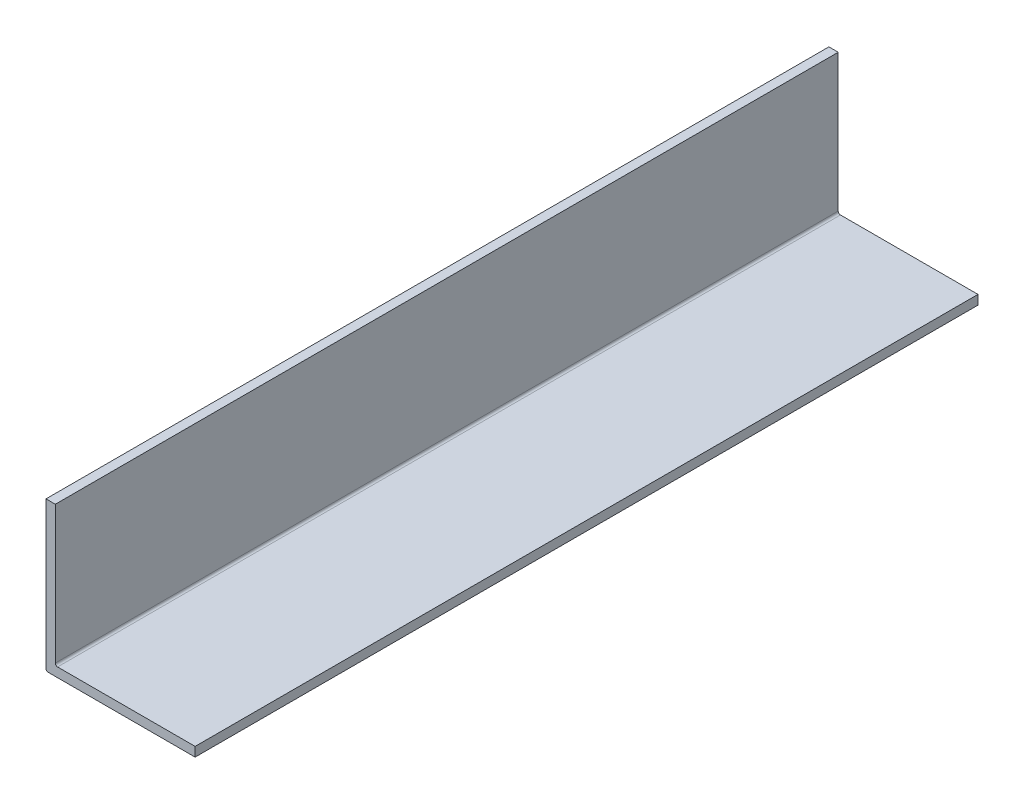
ISO-10303-21;
HEADER;
FILE_DESCRIPTION(('STEP AP214'),'2;1');
FILE_NAME('part.step','',(''),(''),'','','');
FILE_SCHEMA(('AUTOMOTIVE_DESIGN { 1 0 10303 214 1 1 1 1 }'));
ENDSEC;
DATA;
#1=APPLICATION_CONTEXT('core data for automotive mechanical design processes');
#2=APPLICATION_PROTOCOL_DEFINITION('international standard','automotive_design',2000,#1);
#3=PRODUCT_CONTEXT('',#1,'mechanical');
#4=PRODUCT('Part','Part','',(#3));
#5=PRODUCT_RELATED_PRODUCT_CATEGORY('part','',(#4));
#6=PRODUCT_DEFINITION_FORMATION('','',#4);
#7=PRODUCT_DEFINITION_CONTEXT('part definition',#1,'design');
#8=PRODUCT_DEFINITION('design','',#6,#7);
#9=PRODUCT_DEFINITION_SHAPE('','',#8);
#10=(LENGTH_UNIT() NAMED_UNIT(*) SI_UNIT(.MILLI.,.METRE.));
#11=(NAMED_UNIT(*) PLANE_ANGLE_UNIT() SI_UNIT($,.RADIAN.));
#12=(NAMED_UNIT(*) SI_UNIT($,.STERADIAN.) SOLID_ANGLE_UNIT());
#13=UNCERTAINTY_MEASURE_WITH_UNIT(LENGTH_MEASURE(1.E-05),#10,'distance_accuracy_value','');
#14=(GEOMETRIC_REPRESENTATION_CONTEXT(3) GLOBAL_UNCERTAINTY_ASSIGNED_CONTEXT((#13)) GLOBAL_UNIT_ASSIGNED_CONTEXT((#10,
#11,#12)) REPRESENTATION_CONTEXT('',''));
#15=CARTESIAN_POINT('',(0.,0.,0.));
#16=DIRECTION('',(0.,0.,1.));
#17=DIRECTION('',(1.,0.,0.));
#18=AXIS2_PLACEMENT_3D('',#15,#16,#17);
#19=CARTESIAN_POINT('',(0.,50.8,266.7));
#20=DIRECTION('',(0.,-1.,0.));
#21=DIRECTION('',(0.,0.,-1.));
#22=AXIS2_PLACEMENT_3D('',#19,#20,#21);
#23=PLANE('',#22);
#24=DIRECTION('',(-1.,0.,0.));
#25=VECTOR('',#24,1.);
#26=CARTESIAN_POINT('',(0.,50.8,0.));
#27=LINE('',#26,#25);
#28=CARTESIAN_POINT('',(3.17499999999999,50.8,0.));
#29=VERTEX_POINT('',#28);
#30=CARTESIAN_POINT('',(0.,50.8,0.));
#31=VERTEX_POINT('',#30);
#32=EDGE_CURVE('E128',#29,#31,#27,.T.);
#33=ORIENTED_EDGE('',*,*,#32,.T.);
#34=DIRECTION('',(0.,0.,-1.));
#35=VECTOR('',#34,1.);
#36=CARTESIAN_POINT('',(0.,50.8,266.7));
#37=LINE('',#36,#35);
#38=CARTESIAN_POINT('',(0.,50.8,266.7));
#39=VERTEX_POINT('',#38);
#40=EDGE_CURVE('E11',#39,#31,#37,.T.);
#41=ORIENTED_EDGE('',*,*,#40,.F.);
#42=DIRECTION('',(-1.,0.,0.));
#43=VECTOR('',#42,1.);
#44=CARTESIAN_POINT('',(0.,50.8,266.7));
#45=LINE('',#44,#43);
#46=CARTESIAN_POINT('',(3.17499999999999,50.8,266.7));
#47=VERTEX_POINT('',#46);
#48=EDGE_CURVE('E142',#47,#39,#45,.T.);
#49=ORIENTED_EDGE('',*,*,#48,.F.);
#50=DIRECTION('',(0.,0.,-1.));
#51=VECTOR('',#50,1.);
#52=CARTESIAN_POINT('',(3.17499999999999,50.8,266.7));
#53=LINE('',#52,#51);
#54=EDGE_CURVE('E124',#47,#29,#53,.T.);
#55=ORIENTED_EDGE('',*,*,#54,.T.);
#56=EDGE_LOOP('',(#33,#41,#49,#55));
#57=FACE_BOUND('',#56,.T.);
#58=ADVANCED_FACE('F32',(#57),#23,.F.);
#59=CARTESIAN_POINT('',(0.,0.762000000000005,266.7));
#60=DIRECTION('',(1.,0.,0.));
#61=DIRECTION('',(0.,0.,-1.));
#62=AXIS2_PLACEMENT_3D('',#59,#60,#61);
#63=PLANE('',#62);
#64=DIRECTION('',(0.,-1.,0.));
#65=VECTOR('',#64,1.);
#66=CARTESIAN_POINT('',(0.,0.762000000000005,0.));
#67=LINE('',#66,#65);
#68=CARTESIAN_POINT('',(0.,0.762000000000005,0.));
#69=VERTEX_POINT('',#68);
#70=EDGE_CURVE('E131',#31,#69,#67,.T.);
#71=ORIENTED_EDGE('',*,*,#70,.T.);
#72=DIRECTION('',(0.,0.,-1.));
#73=VECTOR('',#72,1.);
#74=CARTESIAN_POINT('',(0.,0.762000000000005,266.7));
#75=LINE('',#74,#73);
#76=CARTESIAN_POINT('',(0.,0.762000000000005,266.7));
#77=VERTEX_POINT('',#76);
#78=EDGE_CURVE('E40',#77,#69,#75,.T.);
#79=ORIENTED_EDGE('',*,*,#78,.F.);
#80=DIRECTION('',(0.,-1.,0.));
#81=VECTOR('',#80,1.);
#82=CARTESIAN_POINT('',(0.,0.762000000000005,266.7));
#83=LINE('',#82,#81);
#84=EDGE_CURVE('E91',#39,#77,#83,.T.);
#85=ORIENTED_EDGE('',*,*,#84,.F.);
#86=ORIENTED_EDGE('',*,*,#40,.T.);
#87=EDGE_LOOP('',(#71,#79,#85,#86));
#88=FACE_BOUND('',#87,.T.);
#89=ADVANCED_FACE('F177',(#88),#63,.F.);
#90=CARTESIAN_POINT('',(0.762,0.762,266.7));
#91=DIRECTION('',(0.,0.,-1.));
#92=DIRECTION('',(-1.,0.,0.));
#93=AXIS2_PLACEMENT_3D('',#90,#91,#92);
#94=CYLINDRICAL_SURFACE('',#93,0.762);
#95=CARTESIAN_POINT('',(0.762,0.762,0.));
#96=DIRECTION('',(0.,0.,1.));
#97=DIRECTION('',(1.,0.,0.));
#98=AXIS2_PLACEMENT_3D('',#95,#96,#97);
#99=CIRCLE('',#98,0.762);
#100=CARTESIAN_POINT('',(0.762000000000005,0.,0.));
#101=VERTEX_POINT('',#100);
#102=EDGE_CURVE('E133',#69,#101,#99,.T.);
#103=ORIENTED_EDGE('',*,*,#102,.T.);
#104=DIRECTION('',(0.,0.,-1.));
#105=VECTOR('',#104,1.);
#106=CARTESIAN_POINT('',(0.762000000000005,0.,266.7));
#107=LINE('',#106,#105);
#108=CARTESIAN_POINT('',(0.762000000000005,0.,266.7));
#109=VERTEX_POINT('',#108);
#110=EDGE_CURVE('E149',#109,#101,#107,.T.);
#111=ORIENTED_EDGE('',*,*,#110,.F.);
#112=CARTESIAN_POINT('',(0.762,0.762,266.7));
#113=DIRECTION('',(0.,0.,1.));
#114=DIRECTION('',(1.,0.,0.));
#115=AXIS2_PLACEMENT_3D('',#112,#113,#114);
#116=CIRCLE('',#115,0.762);
#117=EDGE_CURVE('E157',#77,#109,#116,.T.);
#118=ORIENTED_EDGE('',*,*,#117,.F.);
#119=ORIENTED_EDGE('',*,*,#78,.T.);
#120=EDGE_LOOP('',(#103,#111,#118,#119));
#121=FACE_BOUND('',#120,.T.);
#122=ADVANCED_FACE('F155',(#121),#94,.T.);
#123=CARTESIAN_POINT('',(0.762000000000005,0.,266.7));
#124=DIRECTION('',(0.,1.,0.));
#125=DIRECTION('',(0.,0.,1.));
#126=AXIS2_PLACEMENT_3D('',#123,#124,#125);
#127=PLANE('',#126);
#128=DIRECTION('',(1.,0.,0.));
#129=VECTOR('',#128,1.);
#130=CARTESIAN_POINT('',(0.762000000000005,0.,0.));
#131=LINE('',#130,#129);
#132=CARTESIAN_POINT('',(50.8,0.,0.));
#133=VERTEX_POINT('',#132);
#134=EDGE_CURVE('E135',#101,#133,#131,.T.);
#135=ORIENTED_EDGE('',*,*,#134,.T.);
#136=DIRECTION('',(0.,0.,-1.));
#137=VECTOR('',#136,1.);
#138=CARTESIAN_POINT('',(50.8,0.,266.7));
#139=LINE('',#138,#137);
#140=CARTESIAN_POINT('',(50.8,0.,266.7));
#141=VERTEX_POINT('',#140);
#142=EDGE_CURVE('E146',#141,#133,#139,.T.);
#143=ORIENTED_EDGE('',*,*,#142,.F.);
#144=DIRECTION('',(1.,0.,0.));
#145=VECTOR('',#144,1.);
#146=CARTESIAN_POINT('',(0.762000000000005,0.,266.7));
#147=LINE('',#146,#145);
#148=EDGE_CURVE('E169',#109,#141,#147,.T.);
#149=ORIENTED_EDGE('',*,*,#148,.F.);
#150=ORIENTED_EDGE('',*,*,#110,.T.);
#151=EDGE_LOOP('',(#135,#143,#149,#150));
#152=FACE_BOUND('',#151,.T.);
#153=ADVANCED_FACE('F165',(#152),#127,.F.);
#154=CARTESIAN_POINT('',(50.8,0.,266.7));
#155=DIRECTION('',(-1.,0.,0.));
#156=DIRECTION('',(0.,0.,1.));
#157=AXIS2_PLACEMENT_3D('',#154,#155,#156);
#158=PLANE('',#157);
#159=DIRECTION('',(0.,1.,0.));
#160=VECTOR('',#159,1.);
#161=CARTESIAN_POINT('',(50.8,0.,0.));
#162=LINE('',#161,#160);
#163=CARTESIAN_POINT('',(50.8,3.175,0.));
#164=VERTEX_POINT('',#163);
#165=EDGE_CURVE('E137',#133,#164,#162,.T.);
#166=ORIENTED_EDGE('',*,*,#165,.T.);
#167=DIRECTION('',(0.,0.,-1.));
#168=VECTOR('',#167,1.);
#169=CARTESIAN_POINT('',(50.8,3.175,266.7));
#170=LINE('',#169,#168);
#171=CARTESIAN_POINT('',(50.8,3.175,266.7));
#172=VERTEX_POINT('',#171);
#173=EDGE_CURVE('E119',#172,#164,#170,.T.);
#174=ORIENTED_EDGE('',*,*,#173,.F.);
#175=DIRECTION('',(0.,1.,0.));
#176=VECTOR('',#175,1.);
#177=CARTESIAN_POINT('',(50.8,0.,266.7));
#178=LINE('',#177,#176);
#179=EDGE_CURVE('E110',#141,#172,#178,.T.);
#180=ORIENTED_EDGE('',*,*,#179,.F.);
#181=ORIENTED_EDGE('',*,*,#142,.T.);
#182=EDGE_LOOP('',(#166,#174,#180,#181));
#183=FACE_BOUND('',#182,.T.);
#184=ADVANCED_FACE('F168',(#183),#158,.F.);
#185=CARTESIAN_POINT('',(3.93699999999999,3.175,266.7));
#186=DIRECTION('',(0.,-1.,0.));
#187=DIRECTION('',(0.,0.,-1.));
#188=AXIS2_PLACEMENT_3D('',#185,#186,#187);
#189=PLANE('',#188);
#190=DIRECTION('',(-1.,0.,0.));
#191=VECTOR('',#190,1.);
#192=CARTESIAN_POINT('',(3.93699999999999,3.175,0.));
#193=LINE('',#192,#191);
#194=CARTESIAN_POINT('',(3.93699999999999,3.175,0.));
#195=VERTEX_POINT('',#194);
#196=EDGE_CURVE('E118',#164,#195,#193,.T.);
#197=ORIENTED_EDGE('',*,*,#196,.T.);
#198=DIRECTION('',(0.,0.,-1.));
#199=VECTOR('',#198,1.);
#200=CARTESIAN_POINT('',(3.93699999999999,3.175,266.7));
#201=LINE('',#200,#199);
#202=CARTESIAN_POINT('',(3.93699999999999,3.175,266.7));
#203=VERTEX_POINT('',#202);
#204=EDGE_CURVE('E115',#203,#195,#201,.T.);
#205=ORIENTED_EDGE('',*,*,#204,.F.);
#206=DIRECTION('',(-1.,0.,0.));
#207=VECTOR('',#206,1.);
#208=CARTESIAN_POINT('',(3.93699999999999,3.175,266.7));
#209=LINE('',#208,#207);
#210=EDGE_CURVE('E104',#172,#203,#209,.T.);
#211=ORIENTED_EDGE('',*,*,#210,.F.);
#212=ORIENTED_EDGE('',*,*,#173,.T.);
#213=EDGE_LOOP('',(#197,#205,#211,#212));
#214=FACE_BOUND('',#213,.T.);
#215=ADVANCED_FACE('F116',(#214),#189,.F.);
#216=CARTESIAN_POINT('',(3.93699999999999,3.937,266.7));
#217=DIRECTION('',(0.,0.,-1.));
#218=DIRECTION('',(-1.,0.,0.));
#219=AXIS2_PLACEMENT_3D('',#216,#217,#218);
#220=CYLINDRICAL_SURFACE('',#219,0.762);
#221=CARTESIAN_POINT('',(3.93699999999999,3.937,0.));
#222=DIRECTION('',(0.,0.,-1.));
#223=DIRECTION('',(1.,0.,0.));
#224=AXIS2_PLACEMENT_3D('',#221,#222,#223);
#225=CIRCLE('',#224,0.762);
#226=CARTESIAN_POINT('',(3.17499999999999,3.937,0.));
#227=VERTEX_POINT('',#226);
#228=EDGE_CURVE('E77',#195,#227,#225,.T.);
#229=ORIENTED_EDGE('',*,*,#228,.T.);
#230=DIRECTION('',(0.,0.,-1.));
#231=VECTOR('',#230,1.);
#232=CARTESIAN_POINT('',(3.17499999999999,3.937,266.7));
#233=LINE('',#232,#231);
#234=CARTESIAN_POINT('',(3.17499999999999,3.937,266.7));
#235=VERTEX_POINT('',#234);
#236=EDGE_CURVE('E120',#235,#227,#233,.T.);
#237=ORIENTED_EDGE('',*,*,#236,.F.);
#238=CARTESIAN_POINT('',(3.93699999999999,3.937,266.7));
#239=DIRECTION('',(0.,0.,-1.));
#240=DIRECTION('',(1.,0.,0.));
#241=AXIS2_PLACEMENT_3D('',#238,#239,#240);
#242=CIRCLE('',#241,0.762);
#243=EDGE_CURVE('E108',#203,#235,#242,.T.);
#244=ORIENTED_EDGE('',*,*,#243,.F.);
#245=ORIENTED_EDGE('',*,*,#204,.T.);
#246=EDGE_LOOP('',(#229,#237,#244,#245));
#247=FACE_BOUND('',#246,.T.);
#248=ADVANCED_FACE('F122',(#247),#220,.F.);
#249=CARTESIAN_POINT('',(3.17499999999999,50.8,266.7));
#250=DIRECTION('',(-1.,0.,0.));
#251=DIRECTION('',(0.,-1.,0.));
#252=AXIS2_PLACEMENT_3D('',#249,#250,#251);
#253=PLANE('',#252);
#254=DIRECTION('',(0.,1.,0.));
#255=VECTOR('',#254,1.);
#256=CARTESIAN_POINT('',(3.17499999999999,50.8,0.));
#257=LINE('',#256,#255);
#258=EDGE_CURVE('E83',#227,#29,#257,.T.);
#259=ORIENTED_EDGE('',*,*,#258,.T.);
#260=ORIENTED_EDGE('',*,*,#54,.F.);
#261=DIRECTION('',(0.,1.,0.));
#262=VECTOR('',#261,1.);
#263=CARTESIAN_POINT('',(3.17499999999999,50.8,266.7));
#264=LINE('',#263,#262);
#265=EDGE_CURVE('E48',#235,#47,#264,.T.);
#266=ORIENTED_EDGE('',*,*,#265,.F.);
#267=ORIENTED_EDGE('',*,*,#236,.T.);
#268=EDGE_LOOP('',(#259,#260,#266,#267));
#269=FACE_BOUND('',#268,.T.);
#270=ADVANCED_FACE('F193',(#269),#253,.F.);
#271=CARTESIAN_POINT('',(3.93699999999999,3.937,266.7));
#272=DIRECTION('',(0.,0.,1.));
#273=DIRECTION('',(1.,0.,0.));
#274=AXIS2_PLACEMENT_3D('',#271,#272,#273);
#275=PLANE('',#274);
#276=ORIENTED_EDGE('',*,*,#48,.T.);
#277=ORIENTED_EDGE('',*,*,#84,.T.);
#278=ORIENTED_EDGE('',*,*,#117,.T.);
#279=ORIENTED_EDGE('',*,*,#148,.T.);
#280=ORIENTED_EDGE('',*,*,#179,.T.);
#281=ORIENTED_EDGE('',*,*,#210,.T.);
#282=ORIENTED_EDGE('',*,*,#243,.T.);
#283=ORIENTED_EDGE('',*,*,#265,.T.);
#284=EDGE_LOOP('',(#276,#277,#278,#279,#280,#281,#282,#283));
#285=FACE_BOUND('',#284,.T.);
#286=ADVANCED_FACE('F106',(#285),#275,.T.);
#287=CARTESIAN_POINT('',(3.93699999999999,3.937,0.));
#288=DIRECTION('',(0.,0.,1.));
#289=DIRECTION('',(1.,0.,0.));
#290=AXIS2_PLACEMENT_3D('',#287,#288,#289);
#291=PLANE('',#290);
#292=ORIENTED_EDGE('',*,*,#32,.F.);
#293=ORIENTED_EDGE('',*,*,#258,.F.);
#294=ORIENTED_EDGE('',*,*,#228,.F.);
#295=ORIENTED_EDGE('',*,*,#196,.F.);
#296=ORIENTED_EDGE('',*,*,#165,.F.);
#297=ORIENTED_EDGE('',*,*,#134,.F.);
#298=ORIENTED_EDGE('',*,*,#102,.F.);
#299=ORIENTED_EDGE('',*,*,#70,.F.);
#300=EDGE_LOOP('',(#292,#293,#294,#295,#296,#297,#298,#299));
#301=FACE_BOUND('',#300,.T.);
#302=ADVANCED_FACE('F161',(#301),#291,.F.);
#303=CLOSED_SHELL('',(#58,#89,#122,#153,#184,#215,#248,#270,#286,#302));
#304=MANIFOLD_SOLID_BREP('B2',#303);
#305=ADVANCED_BREP_SHAPE_REPRESENTATION('',(#18,#304),#14);
#306=SHAPE_DEFINITION_REPRESENTATION(#9,#305);
ENDSEC;
END-ISO-10303-21;
